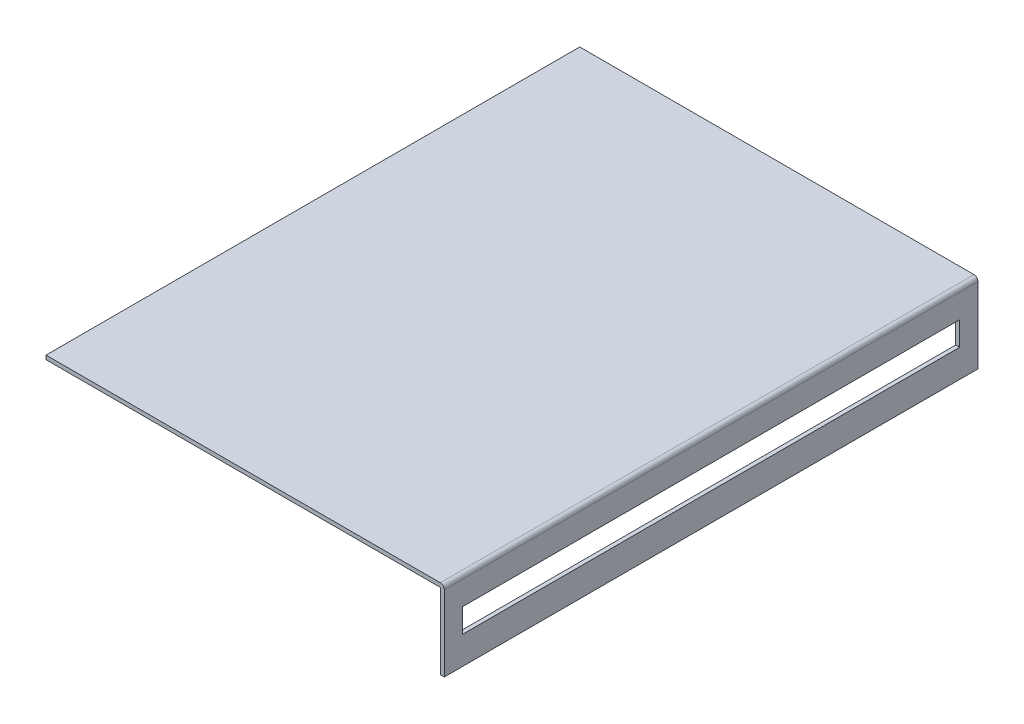
ISO-10303-21;
HEADER;
FILE_DESCRIPTION(('STEP AP214'),'2;1');
FILE_NAME('part.step','',(''),(''),'','','');
FILE_SCHEMA(('AUTOMOTIVE_DESIGN { 1 0 10303 214 1 1 1 1 }'));
ENDSEC;
DATA;
#1=APPLICATION_CONTEXT('core data for automotive mechanical design processes');
#2=APPLICATION_PROTOCOL_DEFINITION('international standard','automotive_design',2000,#1);
#3=PRODUCT_CONTEXT('',#1,'mechanical');
#4=PRODUCT('Part','Part','',(#3));
#5=PRODUCT_RELATED_PRODUCT_CATEGORY('part','',(#4));
#6=PRODUCT_DEFINITION_FORMATION('','',#4);
#7=PRODUCT_DEFINITION_CONTEXT('part definition',#1,'design');
#8=PRODUCT_DEFINITION('design','',#6,#7);
#9=PRODUCT_DEFINITION_SHAPE('','',#8);
#10=(LENGTH_UNIT() NAMED_UNIT(*) SI_UNIT(.MILLI.,.METRE.));
#11=(NAMED_UNIT(*) PLANE_ANGLE_UNIT() SI_UNIT($,.RADIAN.));
#12=(NAMED_UNIT(*) SI_UNIT($,.STERADIAN.) SOLID_ANGLE_UNIT());
#13=UNCERTAINTY_MEASURE_WITH_UNIT(LENGTH_MEASURE(1.E-05),#10,'distance_accuracy_value','');
#14=(GEOMETRIC_REPRESENTATION_CONTEXT(3) GLOBAL_UNCERTAINTY_ASSIGNED_CONTEXT((#13)) GLOBAL_UNIT_ASSIGNED_CONTEXT((#10,
#11,#12)) REPRESENTATION_CONTEXT('',''));
#15=CARTESIAN_POINT('',(0.,0.,0.));
#16=DIRECTION('',(0.,0.,1.));
#17=DIRECTION('',(1.,0.,0.));
#18=AXIS2_PLACEMENT_3D('',#15,#16,#17);
#19=CARTESIAN_POINT('',(12.5,0.,0.));
#20=DIRECTION('',(-1.,0.,0.));
#21=DIRECTION('',(0.,-1.,0.));
#22=AXIS2_PLACEMENT_3D('',#19,#20,#21);
#23=PLANE('',#22);
#24=DIRECTION('',(0.,0.,1.));
#25=VECTOR('',#24,1.);
#26=CARTESIAN_POINT('',(12.5,-5.,-16.75));
#27=LINE('',#26,#25);
#28=CARTESIAN_POINT('',(12.5,-5.,16.75));
#29=VERTEX_POINT('',#28);
#30=CARTESIAN_POINT('',(12.5,-5.,-16.75));
#31=VERTEX_POINT('',#30);
#32=EDGE_CURVE('E112',#29,#31,#27,.F.);
#33=ORIENTED_EDGE('',*,*,#32,.T.);
#34=DIRECTION('',(0.,1.,0.));
#35=VECTOR('',#34,1.);
#36=CARTESIAN_POINT('',(12.5,-0.249999999999999,-16.75));
#37=LINE('',#36,#35);
#38=CARTESIAN_POINT('',(12.5,-0.25,-16.75));
#39=VERTEX_POINT('',#38);
#40=EDGE_CURVE('E109',#31,#39,#37,.T.);
#41=ORIENTED_EDGE('',*,*,#40,.T.);
#42=DIRECTION('',(0.,0.,-1.));
#43=VECTOR('',#42,1.);
#44=CARTESIAN_POINT('',(12.5,-0.249999999999999,-16.75));
#45=LINE('',#44,#43);
#46=CARTESIAN_POINT('',(12.5,-0.25,16.75));
#47=VERTEX_POINT('',#46);
#48=EDGE_CURVE('E98',#47,#39,#45,.T.);
#49=ORIENTED_EDGE('',*,*,#48,.F.);
#50=DIRECTION('',(0.,1.,0.));
#51=VECTOR('',#50,1.);
#52=CARTESIAN_POINT('',(12.5,-5.,16.75));
#53=LINE('',#52,#51);
#54=EDGE_CURVE('E116',#47,#29,#53,.F.);
#55=ORIENTED_EDGE('',*,*,#54,.T.);
#56=EDGE_LOOP('',(#33,#41,#49,#55));
#57=FACE_BOUND('',#56,.T.);
#58=DIRECTION('',(0.,1.,0.));
#59=VECTOR('',#58,1.);
#60=CARTESIAN_POINT('',(12.5,-1.75,15.6));
#61=LINE('',#60,#59);
#62=CARTESIAN_POINT('',(12.5,-3.25,15.6));
#63=VERTEX_POINT('',#62);
#64=CARTESIAN_POINT('',(12.5,-1.75,15.6));
#65=VERTEX_POINT('',#64);
#66=EDGE_CURVE('E122',#63,#65,#61,.T.);
#67=ORIENTED_EDGE('',*,*,#66,.T.);
#68=DIRECTION('',(0.,0.,1.));
#69=VECTOR('',#68,1.);
#70=CARTESIAN_POINT('',(12.5,-1.75,15.6));
#71=LINE('',#70,#69);
#72=CARTESIAN_POINT('',(12.5,-1.75,-15.6));
#73=VERTEX_POINT('',#72);
#74=EDGE_CURVE('E149',#65,#73,#71,.F.);
#75=ORIENTED_EDGE('',*,*,#74,.T.);
#76=DIRECTION('',(0.,1.,0.));
#77=VECTOR('',#76,1.);
#78=CARTESIAN_POINT('',(12.5,-1.75,-15.6));
#79=LINE('',#78,#77);
#80=CARTESIAN_POINT('',(12.5,-3.25,-15.6));
#81=VERTEX_POINT('',#80);
#82=EDGE_CURVE('E191',#73,#81,#79,.F.);
#83=ORIENTED_EDGE('',*,*,#82,.T.);
#84=DIRECTION('',(0.,0.,1.));
#85=VECTOR('',#84,1.);
#86=CARTESIAN_POINT('',(12.5,-3.25,15.6));
#87=LINE('',#86,#85);
#88=EDGE_CURVE('E128',#81,#63,#87,.T.);
#89=ORIENTED_EDGE('',*,*,#88,.T.);
#90=EDGE_LOOP('',(#67,#75,#83,#89));
#91=FACE_BOUND('',#90,.T.);
#92=ADVANCED_FACE('F17',(#57,#91),#23,.F.);
#93=CARTESIAN_POINT('',(12.25,-0.25,-16.75));
#94=DIRECTION('',(0.,0.,-1.));
#95=DIRECTION('',(0.,1.,0.));
#96=AXIS2_PLACEMENT_3D('',#93,#94,#95);
#97=CYLINDRICAL_SURFACE('',#96,0.250000000000002);
#98=CARTESIAN_POINT('',(12.25,-0.25,16.75));
#99=DIRECTION('',(0.,0.,-1.));
#100=DIRECTION('',(0.,1.,0.));
#101=AXIS2_PLACEMENT_3D('',#98,#99,#100);
#102=CIRCLE('',#101,0.250000000000002);
#103=CARTESIAN_POINT('',(12.25,0.,16.75));
#104=VERTEX_POINT('',#103);
#105=EDGE_CURVE('E104',#47,#104,#102,.F.);
#106=ORIENTED_EDGE('',*,*,#105,.F.);
#107=ORIENTED_EDGE('',*,*,#48,.T.);
#108=CARTESIAN_POINT('',(12.25,-0.25,-16.75));
#109=DIRECTION('',(0.,0.,-1.));
#110=DIRECTION('',(0.,1.,0.));
#111=AXIS2_PLACEMENT_3D('',#108,#109,#110);
#112=CIRCLE('',#111,0.250000000000002);
#113=CARTESIAN_POINT('',(12.25,0.,-16.75));
#114=VERTEX_POINT('',#113);
#115=EDGE_CURVE('E20',#39,#114,#112,.F.);
#116=ORIENTED_EDGE('',*,*,#115,.T.);
#117=DIRECTION('',(0.,0.,-1.));
#118=VECTOR('',#117,1.);
#119=CARTESIAN_POINT('',(12.25,0.,0.));
#120=LINE('',#119,#118);
#121=EDGE_CURVE('E134',#114,#104,#120,.F.);
#122=ORIENTED_EDGE('',*,*,#121,.T.);
#123=EDGE_LOOP('',(#106,#107,#116,#122));
#124=FACE_BOUND('',#123,.T.);
#125=ADVANCED_FACE('F100',(#124),#97,.T.);
#126=CARTESIAN_POINT('',(12.25,-1.75,15.6));
#127=DIRECTION('',(0.,0.,1.));
#128=DIRECTION('',(1.,0.,0.));
#129=AXIS2_PLACEMENT_3D('',#126,#127,#128);
#130=PLANE('',#129);
#131=DIRECTION('',(1.,0.,0.));
#132=VECTOR('',#131,1.);
#133=CARTESIAN_POINT('',(12.25,-3.25,15.6));
#134=LINE('',#133,#132);
#135=CARTESIAN_POINT('',(12.25,-3.25,15.6));
#136=VERTEX_POINT('',#135);
#137=EDGE_CURVE('E123',#63,#136,#134,.F.);
#138=ORIENTED_EDGE('',*,*,#137,.T.);
#139=DIRECTION('',(0.,-1.,0.));
#140=VECTOR('',#139,1.);
#141=CARTESIAN_POINT('',(12.25,0.,15.6));
#142=LINE('',#141,#140);
#143=CARTESIAN_POINT('',(12.25,-1.75,15.6));
#144=VERTEX_POINT('',#143);
#145=EDGE_CURVE('E133',#144,#136,#142,.T.);
#146=ORIENTED_EDGE('',*,*,#145,.F.);
#147=DIRECTION('',(-1.,0.,0.));
#148=VECTOR('',#147,1.);
#149=CARTESIAN_POINT('',(12.25,-1.75,15.6));
#150=LINE('',#149,#148);
#151=EDGE_CURVE('E187',#144,#65,#150,.F.);
#152=ORIENTED_EDGE('',*,*,#151,.T.);
#153=ORIENTED_EDGE('',*,*,#66,.F.);
#154=EDGE_LOOP('',(#138,#146,#152,#153));
#155=FACE_BOUND('',#154,.T.);
#156=ADVANCED_FACE('F204',(#155),#130,.F.);
#157=CARTESIAN_POINT('',(12.25,-3.25,15.6));
#158=DIRECTION('',(0.,-1.,0.));
#159=DIRECTION('',(1.,0.,0.));
#160=AXIS2_PLACEMENT_3D('',#157,#158,#159);
#161=PLANE('',#160);
#162=DIRECTION('',(-1.,0.,0.));
#163=VECTOR('',#162,1.);
#164=CARTESIAN_POINT('',(12.25,-3.25,-15.6));
#165=LINE('',#164,#163);
#166=CARTESIAN_POINT('',(12.25,-3.25,-15.6));
#167=VERTEX_POINT('',#166);
#168=EDGE_CURVE('E194',#81,#167,#165,.T.);
#169=ORIENTED_EDGE('',*,*,#168,.T.);
#170=DIRECTION('',(0.,0.,1.));
#171=VECTOR('',#170,1.);
#172=CARTESIAN_POINT('',(12.25,-3.25,0.));
#173=LINE('',#172,#171);
#174=EDGE_CURVE('E201',#136,#167,#173,.F.);
#175=ORIENTED_EDGE('',*,*,#174,.F.);
#176=ORIENTED_EDGE('',*,*,#137,.F.);
#177=ORIENTED_EDGE('',*,*,#88,.F.);
#178=EDGE_LOOP('',(#169,#175,#176,#177));
#179=FACE_BOUND('',#178,.T.);
#180=ADVANCED_FACE('F199',(#179),#161,.F.);
#181=CARTESIAN_POINT('',(12.25,-1.75,-15.6));
#182=DIRECTION('',(0.,0.,-1.));
#183=DIRECTION('',(-1.,0.,0.));
#184=AXIS2_PLACEMENT_3D('',#181,#182,#183);
#185=PLANE('',#184);
#186=DIRECTION('',(-1.,0.,0.));
#187=VECTOR('',#186,1.);
#188=CARTESIAN_POINT('',(12.25,-1.75,-15.6));
#189=LINE('',#188,#187);
#190=CARTESIAN_POINT('',(12.25,-1.75,-15.6));
#191=VERTEX_POINT('',#190);
#192=EDGE_CURVE('E189',#73,#191,#189,.T.);
#193=ORIENTED_EDGE('',*,*,#192,.T.);
#194=DIRECTION('',(0.,-1.,0.));
#195=VECTOR('',#194,1.);
#196=CARTESIAN_POINT('',(12.25,0.,-15.6));
#197=LINE('',#196,#195);
#198=EDGE_CURVE('E216',#167,#191,#197,.F.);
#199=ORIENTED_EDGE('',*,*,#198,.F.);
#200=ORIENTED_EDGE('',*,*,#168,.F.);
#201=ORIENTED_EDGE('',*,*,#82,.F.);
#202=EDGE_LOOP('',(#193,#199,#200,#201));
#203=FACE_BOUND('',#202,.T.);
#204=ADVANCED_FACE('F215',(#203),#185,.F.);
#205=CARTESIAN_POINT('',(12.25,-1.75,15.6));
#206=DIRECTION('',(0.,1.,0.));
#207=DIRECTION('',(-1.,0.,0.));
#208=AXIS2_PLACEMENT_3D('',#205,#206,#207);
#209=PLANE('',#208);
#210=ORIENTED_EDGE('',*,*,#151,.F.);
#211=DIRECTION('',(0.,0.,1.));
#212=VECTOR('',#211,1.);
#213=CARTESIAN_POINT('',(12.25,-1.75,0.));
#214=LINE('',#213,#212);
#215=EDGE_CURVE('E167',#191,#144,#214,.T.);
#216=ORIENTED_EDGE('',*,*,#215,.F.);
#217=ORIENTED_EDGE('',*,*,#192,.F.);
#218=ORIENTED_EDGE('',*,*,#74,.F.);
#219=EDGE_LOOP('',(#210,#216,#217,#218));
#220=FACE_BOUND('',#219,.T.);
#221=ADVANCED_FACE('F211',(#220),#209,.F.);
#222=CARTESIAN_POINT('',(12.5,-5.,-16.75));
#223=DIRECTION('',(0.,1.,0.));
#224=DIRECTION('',(-1.,0.,0.));
#225=AXIS2_PLACEMENT_3D('',#222,#223,#224);
#226=PLANE('',#225);
#227=DIRECTION('',(-1.,0.,0.));
#228=VECTOR('',#227,1.);
#229=CARTESIAN_POINT('',(12.5,-5.,-16.75));
#230=LINE('',#229,#228);
#231=CARTESIAN_POINT('',(12.25,-5.,-16.75));
#232=VERTEX_POINT('',#231);
#233=EDGE_CURVE('E153',#31,#232,#230,.T.);
#234=ORIENTED_EDGE('',*,*,#233,.F.);
#235=ORIENTED_EDGE('',*,*,#32,.F.);
#236=DIRECTION('',(-1.,0.,0.));
#237=VECTOR('',#236,1.);
#238=CARTESIAN_POINT('',(12.5,-5.,16.75));
#239=LINE('',#238,#237);
#240=CARTESIAN_POINT('',(12.25,-5.,16.75));
#241=VERTEX_POINT('',#240);
#242=EDGE_CURVE('E115',#241,#29,#239,.F.);
#243=ORIENTED_EDGE('',*,*,#242,.F.);
#244=DIRECTION('',(0.,0.,1.));
#245=VECTOR('',#244,1.);
#246=CARTESIAN_POINT('',(12.25,-5.,0.));
#247=LINE('',#246,#245);
#248=EDGE_CURVE('E138',#232,#241,#247,.T.);
#249=ORIENTED_EDGE('',*,*,#248,.F.);
#250=EDGE_LOOP('',(#234,#235,#243,#249));
#251=FACE_BOUND('',#250,.T.);
#252=ADVANCED_FACE('F239',(#251),#226,.F.);
#253=CARTESIAN_POINT('',(0.,0.,0.));
#254=DIRECTION('',(0.,-1.,0.));
#255=DIRECTION('',(0.,0.,-1.));
#256=AXIS2_PLACEMENT_3D('',#253,#254,#255);
#257=PLANE('',#256);
#258=DIRECTION('',(-1.,0.,0.));
#259=VECTOR('',#258,1.);
#260=CARTESIAN_POINT('',(-12.5,0.,-16.75));
#261=LINE('',#260,#259);
#262=CARTESIAN_POINT('',(-12.5,0.,-16.75));
#263=VERTEX_POINT('',#262);
#264=EDGE_CURVE('E121',#263,#114,#261,.F.);
#265=ORIENTED_EDGE('',*,*,#264,.F.);
#266=DIRECTION('',(0.,0.,1.));
#267=VECTOR('',#266,1.);
#268=CARTESIAN_POINT('',(-12.5,0.,16.75));
#269=LINE('',#268,#267);
#270=CARTESIAN_POINT('',(-12.5,0.,16.75));
#271=VERTEX_POINT('',#270);
#272=EDGE_CURVE('E223',#271,#263,#269,.F.);
#273=ORIENTED_EDGE('',*,*,#272,.F.);
#274=DIRECTION('',(1.,0.,0.));
#275=VECTOR('',#274,1.);
#276=CARTESIAN_POINT('',(-12.5,0.,16.75));
#277=LINE('',#276,#275);
#278=EDGE_CURVE('E164',#104,#271,#277,.F.);
#279=ORIENTED_EDGE('',*,*,#278,.F.);
#280=ORIENTED_EDGE('',*,*,#121,.F.);
#281=EDGE_LOOP('',(#265,#273,#279,#280));
#282=FACE_BOUND('',#281,.T.);
#283=ADVANCED_FACE('F248',(#282),#257,.F.);
#284=CARTESIAN_POINT('',(-12.5,-0.25,-16.75));
#285=DIRECTION('',(0.,0.,-1.));
#286=DIRECTION('',(-1.,0.,0.));
#287=AXIS2_PLACEMENT_3D('',#284,#285,#286);
#288=PLANE('',#287);
#289=DIRECTION('',(0.,1.,0.));
#290=VECTOR('',#289,1.);
#291=CARTESIAN_POINT('',(-12.5,-0.25,-16.75));
#292=LINE('',#291,#290);
#293=CARTESIAN_POINT('',(-12.5,-0.25,-16.75));
#294=VERTEX_POINT('',#293);
#295=EDGE_CURVE('E226',#263,#294,#292,.F.);
#296=ORIENTED_EDGE('',*,*,#295,.F.);
#297=ORIENTED_EDGE('',*,*,#264,.T.);
#298=ORIENTED_EDGE('',*,*,#115,.F.);
#299=ORIENTED_EDGE('',*,*,#40,.F.);
#300=ORIENTED_EDGE('',*,*,#233,.T.);
#301=DIRECTION('',(0.,-1.,0.));
#302=VECTOR('',#301,1.);
#303=CARTESIAN_POINT('',(12.25,0.,-16.75));
#304=LINE('',#303,#302);
#305=CARTESIAN_POINT('',(12.25,-0.25,-16.75));
#306=VERTEX_POINT('',#305);
#307=EDGE_CURVE('E135',#306,#232,#304,.T.);
#308=ORIENTED_EDGE('',*,*,#307,.F.);
#309=DIRECTION('',(1.,0.,0.));
#310=VECTOR('',#309,1.);
#311=CARTESIAN_POINT('',(0.,-0.25,-16.75));
#312=LINE('',#311,#310);
#313=EDGE_CURVE('E142',#294,#306,#312,.T.);
#314=ORIENTED_EDGE('',*,*,#313,.F.);
#315=EDGE_LOOP('',(#296,#297,#298,#299,#300,#308,#314));
#316=FACE_BOUND('',#315,.T.);
#317=ADVANCED_FACE('F120',(#316),#288,.T.);
#318=CARTESIAN_POINT('',(12.25,0.,0.));
#319=DIRECTION('',(-1.,0.,0.));
#320=DIRECTION('',(0.,-1.,0.));
#321=AXIS2_PLACEMENT_3D('',#318,#319,#320);
#322=PLANE('',#321);
#323=ORIENTED_EDGE('',*,*,#307,.T.);
#324=ORIENTED_EDGE('',*,*,#248,.T.);
#325=DIRECTION('',(0.,-1.,0.));
#326=VECTOR('',#325,1.);
#327=CARTESIAN_POINT('',(12.25,0.,16.75));
#328=LINE('',#327,#326);
#329=CARTESIAN_POINT('',(12.25,-0.25,16.75));
#330=VERTEX_POINT('',#329);
#331=EDGE_CURVE('E139',#241,#330,#328,.F.);
#332=ORIENTED_EDGE('',*,*,#331,.T.);
#333=DIRECTION('',(0.,0.,-1.));
#334=VECTOR('',#333,1.);
#335=CARTESIAN_POINT('',(12.25,-0.25,0.));
#336=LINE('',#335,#334);
#337=EDGE_CURVE('E145',#306,#330,#336,.F.);
#338=ORIENTED_EDGE('',*,*,#337,.F.);
#339=EDGE_LOOP('',(#323,#324,#332,#338));
#340=FACE_BOUND('',#339,.T.);
#341=ORIENTED_EDGE('',*,*,#198,.T.);
#342=ORIENTED_EDGE('',*,*,#215,.T.);
#343=ORIENTED_EDGE('',*,*,#145,.T.);
#344=ORIENTED_EDGE('',*,*,#174,.T.);
#345=EDGE_LOOP('',(#341,#342,#343,#344));
#346=FACE_BOUND('',#345,.T.);
#347=ADVANCED_FACE('F219',(#340,#346),#322,.T.);
#348=CARTESIAN_POINT('',(-12.5,-0.25,16.75));
#349=DIRECTION('',(0.,0.,1.));
#350=DIRECTION('',(1.,0.,0.));
#351=AXIS2_PLACEMENT_3D('',#348,#349,#350);
#352=PLANE('',#351);
#353=ORIENTED_EDGE('',*,*,#278,.T.);
#354=DIRECTION('',(0.,1.,0.));
#355=VECTOR('',#354,1.);
#356=CARTESIAN_POINT('',(-12.5,-0.25,16.75));
#357=LINE('',#356,#355);
#358=CARTESIAN_POINT('',(-12.5,-0.25,16.75));
#359=VERTEX_POINT('',#358);
#360=EDGE_CURVE('E35',#359,#271,#357,.T.);
#361=ORIENTED_EDGE('',*,*,#360,.F.);
#362=DIRECTION('',(1.,0.,0.));
#363=VECTOR('',#362,1.);
#364=CARTESIAN_POINT('',(0.,-0.25,16.75));
#365=LINE('',#364,#363);
#366=EDGE_CURVE('E26',#330,#359,#365,.F.);
#367=ORIENTED_EDGE('',*,*,#366,.F.);
#368=ORIENTED_EDGE('',*,*,#331,.F.);
#369=ORIENTED_EDGE('',*,*,#242,.T.);
#370=ORIENTED_EDGE('',*,*,#54,.F.);
#371=ORIENTED_EDGE('',*,*,#105,.T.);
#372=EDGE_LOOP('',(#353,#361,#367,#368,#369,#370,#371));
#373=FACE_BOUND('',#372,.T.);
#374=ADVANCED_FACE('F234',(#373),#352,.T.);
#375=CARTESIAN_POINT('',(-12.5,-0.25,16.75));
#376=DIRECTION('',(-1.,0.,0.));
#377=DIRECTION('',(0.,0.,1.));
#378=AXIS2_PLACEMENT_3D('',#375,#376,#377);
#379=PLANE('',#378);
#380=DIRECTION('',(0.,0.,-1.));
#381=VECTOR('',#380,1.);
#382=CARTESIAN_POINT('',(-12.5,-0.25,0.));
#383=LINE('',#382,#381);
#384=EDGE_CURVE('E11',#359,#294,#383,.T.);
#385=ORIENTED_EDGE('',*,*,#384,.F.);
#386=ORIENTED_EDGE('',*,*,#360,.T.);
#387=ORIENTED_EDGE('',*,*,#272,.T.);
#388=ORIENTED_EDGE('',*,*,#295,.T.);
#389=EDGE_LOOP('',(#385,#386,#387,#388));
#390=FACE_BOUND('',#389,.T.);
#391=ADVANCED_FACE('F230',(#390),#379,.T.);
#392=CARTESIAN_POINT('',(0.,-0.25,0.));
#393=DIRECTION('',(0.,-1.,0.));
#394=DIRECTION('',(0.,0.,-1.));
#395=AXIS2_PLACEMENT_3D('',#392,#393,#394);
#396=PLANE('',#395);
#397=ORIENTED_EDGE('',*,*,#366,.T.);
#398=ORIENTED_EDGE('',*,*,#384,.T.);
#399=ORIENTED_EDGE('',*,*,#313,.T.);
#400=ORIENTED_EDGE('',*,*,#337,.T.);
#401=EDGE_LOOP('',(#397,#398,#399,#400));
#402=FACE_BOUND('',#401,.T.);
#403=ADVANCED_FACE('F232',(#402),#396,.T.);
#404=CLOSED_SHELL('',(#92,#125,#156,#180,#204,#221,#252,#283,#317,#347,#374,#391,#403));
#405=MANIFOLD_SOLID_BREP('B1',#404);
#406=ADVANCED_BREP_SHAPE_REPRESENTATION('',(#18,#405),#14);
#407=SHAPE_DEFINITION_REPRESENTATION(#9,#406);
ENDSEC;
END-ISO-10303-21;
